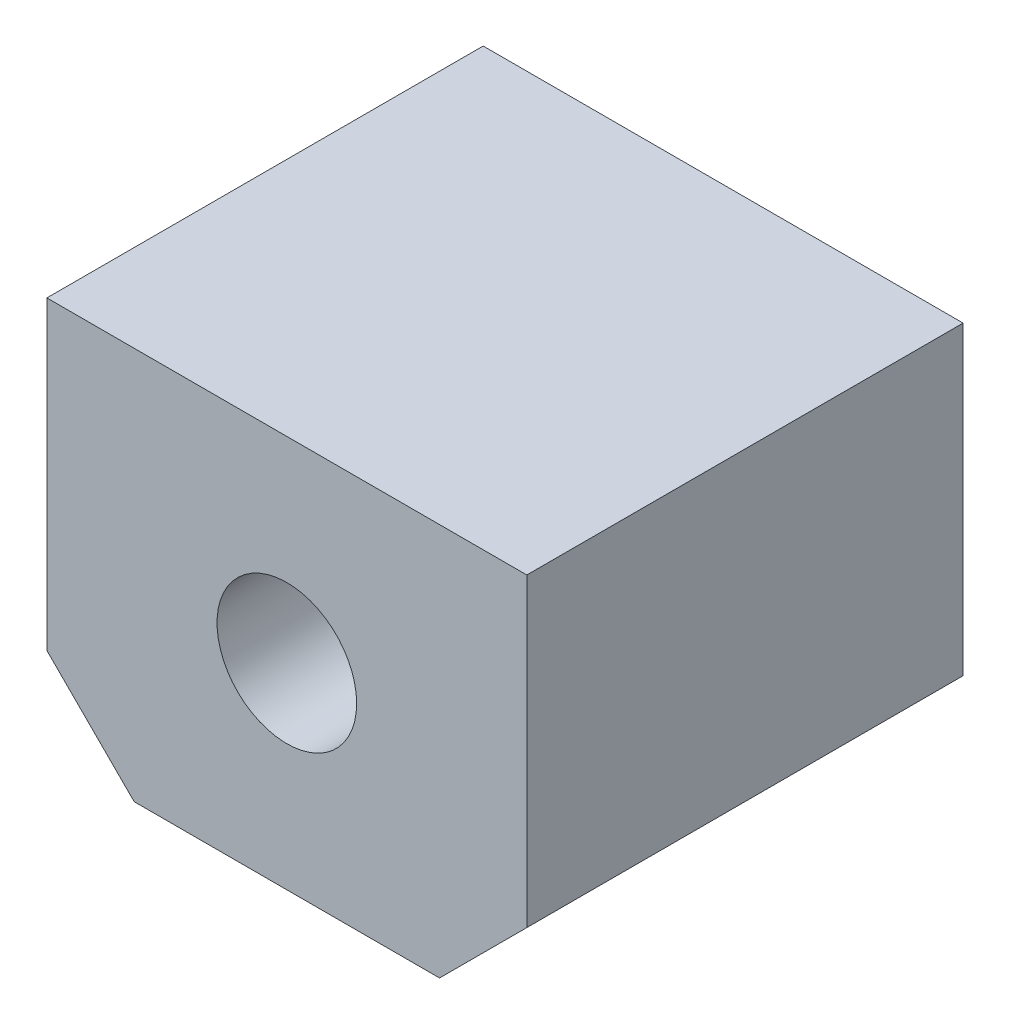
ISO-10303-21;
HEADER;
FILE_DESCRIPTION(('STEP AP214'),'2;1');
FILE_NAME('part.step','',(''),(''),'','','');
FILE_SCHEMA(('AUTOMOTIVE_DESIGN { 1 0 10303 214 1 1 1 1 }'));
ENDSEC;
DATA;
#1=APPLICATION_CONTEXT('core data for automotive mechanical design processes');
#2=APPLICATION_PROTOCOL_DEFINITION('international standard','automotive_design',2000,#1);
#3=PRODUCT_CONTEXT('',#1,'mechanical');
#4=PRODUCT('Part','Part','',(#3));
#5=PRODUCT_RELATED_PRODUCT_CATEGORY('part','',(#4));
#6=PRODUCT_DEFINITION_FORMATION('','',#4);
#7=PRODUCT_DEFINITION_CONTEXT('part definition',#1,'design');
#8=PRODUCT_DEFINITION('design','',#6,#7);
#9=PRODUCT_DEFINITION_SHAPE('','',#8);
#10=(LENGTH_UNIT() NAMED_UNIT(*) SI_UNIT(.MILLI.,.METRE.));
#11=(NAMED_UNIT(*) PLANE_ANGLE_UNIT() SI_UNIT($,.RADIAN.));
#12=(NAMED_UNIT(*) SI_UNIT($,.STERADIAN.) SOLID_ANGLE_UNIT());
#13=UNCERTAINTY_MEASURE_WITH_UNIT(LENGTH_MEASURE(1.E-05),#10,'distance_accuracy_value','');
#14=(GEOMETRIC_REPRESENTATION_CONTEXT(3) GLOBAL_UNCERTAINTY_ASSIGNED_CONTEXT((#13)) GLOBAL_UNIT_ASSIGNED_CONTEXT((#10,
#11,#12)) REPRESENTATION_CONTEXT('',''));
#15=CARTESIAN_POINT('',(0.,0.,0.));
#16=DIRECTION('',(0.,0.,1.));
#17=DIRECTION('',(1.,0.,0.));
#18=AXIS2_PLACEMENT_3D('',#15,#16,#17);
#19=CARTESIAN_POINT('',(0.,0.,50.));
#20=DIRECTION('',(0.,0.,1.));
#21=DIRECTION('',(1.,0.,0.));
#22=AXIS2_PLACEMENT_3D('',#19,#20,#21);
#23=PLANE('',#22);
#24=DIRECTION('',(0.,-1.,0.));
#25=VECTOR('',#24,1.);
#26=CARTESIAN_POINT('',(-27.5,-12.5,50.));
#27=LINE('',#26,#25);
#28=CARTESIAN_POINT('',(-27.5,22.5,50.));
#29=VERTEX_POINT('',#28);
#30=CARTESIAN_POINT('',(-27.5,-12.5,50.));
#31=VERTEX_POINT('',#30);
#32=EDGE_CURVE('E129',#29,#31,#27,.T.);
#33=ORIENTED_EDGE('',*,*,#32,.T.);
#34=DIRECTION('',(0.707106781186548,-0.707106781186547,0.));
#35=VECTOR('',#34,1.);
#36=CARTESIAN_POINT('',(-17.5,-22.5,50.));
#37=LINE('',#36,#35);
#38=CARTESIAN_POINT('',(-17.5,-22.5,50.));
#39=VERTEX_POINT('',#38);
#40=EDGE_CURVE('E87',#31,#39,#37,.T.);
#41=ORIENTED_EDGE('',*,*,#40,.T.);
#42=DIRECTION('',(1.,0.,0.));
#43=VECTOR('',#42,1.);
#44=CARTESIAN_POINT('',(17.5,-22.5,50.));
#45=LINE('',#44,#43);
#46=CARTESIAN_POINT('',(17.5,-22.5,50.));
#47=VERTEX_POINT('',#46);
#48=EDGE_CURVE('E100',#39,#47,#45,.T.);
#49=ORIENTED_EDGE('',*,*,#48,.T.);
#50=DIRECTION('',(0.707106781186548,0.707106781186548,0.));
#51=VECTOR('',#50,1.);
#52=CARTESIAN_POINT('',(27.5,-12.5,50.));
#53=LINE('',#52,#51);
#54=CARTESIAN_POINT('',(27.5,-12.5,50.));
#55=VERTEX_POINT('',#54);
#56=EDGE_CURVE('E94',#47,#55,#53,.T.);
#57=ORIENTED_EDGE('',*,*,#56,.T.);
#58=DIRECTION('',(0.,1.,0.));
#59=VECTOR('',#58,1.);
#60=CARTESIAN_POINT('',(27.5,-12.5,50.));
#61=LINE('',#60,#59);
#62=CARTESIAN_POINT('',(27.5,22.5,50.));
#63=VERTEX_POINT('',#62);
#64=EDGE_CURVE('E98',#55,#63,#61,.T.);
#65=ORIENTED_EDGE('',*,*,#64,.T.);
#66=DIRECTION('',(-1.,0.,0.));
#67=VECTOR('',#66,1.);
#68=CARTESIAN_POINT('',(27.5,22.5,50.));
#69=LINE('',#68,#67);
#70=EDGE_CURVE('E50',#63,#29,#69,.T.);
#71=ORIENTED_EDGE('',*,*,#70,.T.);
#72=EDGE_LOOP('',(#33,#41,#49,#57,#65,#71));
#73=FACE_BOUND('',#72,.T.);
#74=CARTESIAN_POINT('',(0.,0.,50.));
#75=DIRECTION('',(0.,0.,1.));
#76=DIRECTION('',(1.,0.,0.));
#77=AXIS2_PLACEMENT_3D('',#74,#75,#76);
#78=CIRCLE('',#77,8.);
#79=CARTESIAN_POINT('',(7.99999999999999,0.,50.));
#80=VERTEX_POINT('',#79);
#81=EDGE_CURVE('E122',#80,#80,#78,.T.);
#82=ORIENTED_EDGE('',*,*,#81,.F.);
#83=EDGE_LOOP('',(#82));
#84=FACE_BOUND('',#83,.T.);
#85=ADVANCED_FACE('F33',(#73,#84),#23,.T.);
#86=CARTESIAN_POINT('',(0.,0.,0.));
#87=DIRECTION('',(0.,0.,1.));
#88=DIRECTION('',(1.,0.,0.));
#89=AXIS2_PLACEMENT_3D('',#86,#87,#88);
#90=PLANE('',#89);
#91=DIRECTION('',(0.,-1.,0.));
#92=VECTOR('',#91,1.);
#93=CARTESIAN_POINT('',(-27.5,-12.5,0.));
#94=LINE('',#93,#92);
#95=CARTESIAN_POINT('',(-27.5,22.5,0.));
#96=VERTEX_POINT('',#95);
#97=CARTESIAN_POINT('',(-27.5,-12.5,0.));
#98=VERTEX_POINT('',#97);
#99=EDGE_CURVE('E118',#96,#98,#94,.T.);
#100=ORIENTED_EDGE('',*,*,#99,.F.);
#101=DIRECTION('',(-1.,0.,0.));
#102=VECTOR('',#101,1.);
#103=CARTESIAN_POINT('',(27.5,22.5,0.));
#104=LINE('',#103,#102);
#105=CARTESIAN_POINT('',(27.5,22.5,0.));
#106=VERTEX_POINT('',#105);
#107=EDGE_CURVE('E79',#106,#96,#104,.T.);
#108=ORIENTED_EDGE('',*,*,#107,.F.);
#109=DIRECTION('',(0.,1.,0.));
#110=VECTOR('',#109,1.);
#111=CARTESIAN_POINT('',(27.5,-12.5,0.));
#112=LINE('',#111,#110);
#113=CARTESIAN_POINT('',(27.5,-12.5,0.));
#114=VERTEX_POINT('',#113);
#115=EDGE_CURVE('E73',#114,#106,#112,.T.);
#116=ORIENTED_EDGE('',*,*,#115,.F.);
#117=DIRECTION('',(0.707106781186548,0.707106781186548,0.));
#118=VECTOR('',#117,1.);
#119=CARTESIAN_POINT('',(27.5,-12.5,0.));
#120=LINE('',#119,#118);
#121=CARTESIAN_POINT('',(17.5,-22.5,0.));
#122=VERTEX_POINT('',#121);
#123=EDGE_CURVE('E108',#122,#114,#120,.T.);
#124=ORIENTED_EDGE('',*,*,#123,.F.);
#125=DIRECTION('',(1.,0.,0.));
#126=VECTOR('',#125,1.);
#127=CARTESIAN_POINT('',(17.5,-22.5,0.));
#128=LINE('',#127,#126);
#129=CARTESIAN_POINT('',(-17.5,-22.5,0.));
#130=VERTEX_POINT('',#129);
#131=EDGE_CURVE('E124',#130,#122,#128,.T.);
#132=ORIENTED_EDGE('',*,*,#131,.F.);
#133=DIRECTION('',(0.707106781186548,-0.707106781186547,0.));
#134=VECTOR('',#133,1.);
#135=CARTESIAN_POINT('',(-17.5,-22.5,0.));
#136=LINE('',#135,#134);
#137=EDGE_CURVE('E121',#98,#130,#136,.T.);
#138=ORIENTED_EDGE('',*,*,#137,.F.);
#139=EDGE_LOOP('',(#100,#108,#116,#124,#132,#138));
#140=FACE_BOUND('',#139,.T.);
#141=CARTESIAN_POINT('',(0.,0.,0.));
#142=DIRECTION('',(0.,0.,1.));
#143=DIRECTION('',(1.,0.,0.));
#144=AXIS2_PLACEMENT_3D('',#141,#142,#143);
#145=CIRCLE('',#144,8.);
#146=CARTESIAN_POINT('',(7.99999999999999,0.,0.));
#147=VERTEX_POINT('',#146);
#148=EDGE_CURVE('E222',#147,#147,#145,.T.);
#149=ORIENTED_EDGE('',*,*,#148,.T.);
#150=EDGE_LOOP('',(#149));
#151=FACE_BOUND('',#150,.T.);
#152=ADVANCED_FACE('F138',(#140,#151),#90,.F.);
#153=CARTESIAN_POINT('',(-27.5,-12.5,50.));
#154=DIRECTION('',(1.,0.,0.));
#155=DIRECTION('',(0.,0.,-1.));
#156=AXIS2_PLACEMENT_3D('',#153,#154,#155);
#157=PLANE('',#156);
#158=ORIENTED_EDGE('',*,*,#99,.T.);
#159=DIRECTION('',(0.,0.,-1.));
#160=VECTOR('',#159,1.);
#161=CARTESIAN_POINT('',(-27.5,-12.5,50.));
#162=LINE('',#161,#160);
#163=EDGE_CURVE('E11',#31,#98,#162,.T.);
#164=ORIENTED_EDGE('',*,*,#163,.F.);
#165=ORIENTED_EDGE('',*,*,#32,.F.);
#166=DIRECTION('',(0.,0.,-1.));
#167=VECTOR('',#166,1.);
#168=CARTESIAN_POINT('',(-27.5,22.5,50.));
#169=LINE('',#168,#167);
#170=EDGE_CURVE('E114',#29,#96,#169,.T.);
#171=ORIENTED_EDGE('',*,*,#170,.T.);
#172=EDGE_LOOP('',(#158,#164,#165,#171));
#173=FACE_BOUND('',#172,.T.);
#174=ADVANCED_FACE('F35',(#173),#157,.F.);
#175=CARTESIAN_POINT('',(-17.5,-22.5,50.));
#176=DIRECTION('',(0.707106781186547,0.707106781186548,0.));
#177=DIRECTION('',(-0.707106781186548,0.707106781186547,0.));
#178=AXIS2_PLACEMENT_3D('',#175,#176,#177);
#179=PLANE('',#178);
#180=ORIENTED_EDGE('',*,*,#137,.T.);
#181=DIRECTION('',(0.,0.,-1.));
#182=VECTOR('',#181,1.);
#183=CARTESIAN_POINT('',(-17.5,-22.5,50.));
#184=LINE('',#183,#182);
#185=EDGE_CURVE('E42',#39,#130,#184,.T.);
#186=ORIENTED_EDGE('',*,*,#185,.F.);
#187=ORIENTED_EDGE('',*,*,#40,.F.);
#188=ORIENTED_EDGE('',*,*,#163,.T.);
#189=EDGE_LOOP('',(#180,#186,#187,#188));
#190=FACE_BOUND('',#189,.T.);
#191=ADVANCED_FACE('F163',(#190),#179,.F.);
#192=CARTESIAN_POINT('',(17.5,-22.5,50.));
#193=DIRECTION('',(0.,1.,0.));
#194=DIRECTION('',(-1.,0.,0.));
#195=AXIS2_PLACEMENT_3D('',#192,#193,#194);
#196=PLANE('',#195);
#197=ORIENTED_EDGE('',*,*,#131,.T.);
#198=DIRECTION('',(0.,0.,-1.));
#199=VECTOR('',#198,1.);
#200=CARTESIAN_POINT('',(17.5,-22.5,50.));
#201=LINE('',#200,#199);
#202=EDGE_CURVE('E109',#47,#122,#201,.T.);
#203=ORIENTED_EDGE('',*,*,#202,.F.);
#204=ORIENTED_EDGE('',*,*,#48,.F.);
#205=ORIENTED_EDGE('',*,*,#185,.T.);
#206=EDGE_LOOP('',(#197,#203,#204,#205));
#207=FACE_BOUND('',#206,.T.);
#208=ADVANCED_FACE('F135',(#207),#196,.F.);
#209=CARTESIAN_POINT('',(27.5,-12.5,50.));
#210=DIRECTION('',(-0.707106781186548,0.707106781186548,0.));
#211=DIRECTION('',(-0.707106781186548,-0.707106781186548,0.));
#212=AXIS2_PLACEMENT_3D('',#209,#210,#211);
#213=PLANE('',#212);
#214=ORIENTED_EDGE('',*,*,#123,.T.);
#215=DIRECTION('',(0.,0.,-1.));
#216=VECTOR('',#215,1.);
#217=CARTESIAN_POINT('',(27.5,-12.5,50.));
#218=LINE('',#217,#216);
#219=EDGE_CURVE('E105',#55,#114,#218,.T.);
#220=ORIENTED_EDGE('',*,*,#219,.F.);
#221=ORIENTED_EDGE('',*,*,#56,.F.);
#222=ORIENTED_EDGE('',*,*,#202,.T.);
#223=EDGE_LOOP('',(#214,#220,#221,#222));
#224=FACE_BOUND('',#223,.T.);
#225=ADVANCED_FACE('F106',(#224),#213,.F.);
#226=CARTESIAN_POINT('',(27.5,-12.5,50.));
#227=DIRECTION('',(-1.,0.,0.));
#228=DIRECTION('',(0.,0.,1.));
#229=AXIS2_PLACEMENT_3D('',#226,#227,#228);
#230=PLANE('',#229);
#231=ORIENTED_EDGE('',*,*,#115,.T.);
#232=DIRECTION('',(0.,0.,-1.));
#233=VECTOR('',#232,1.);
#234=CARTESIAN_POINT('',(27.5,22.5,50.));
#235=LINE('',#234,#233);
#236=EDGE_CURVE('E110',#63,#106,#235,.T.);
#237=ORIENTED_EDGE('',*,*,#236,.F.);
#238=ORIENTED_EDGE('',*,*,#64,.F.);
#239=ORIENTED_EDGE('',*,*,#219,.T.);
#240=EDGE_LOOP('',(#231,#237,#238,#239));
#241=FACE_BOUND('',#240,.T.);
#242=ADVANCED_FACE('F112',(#241),#230,.F.);
#243=CARTESIAN_POINT('',(27.5,22.5,50.));
#244=DIRECTION('',(0.,-1.,0.));
#245=DIRECTION('',(1.,0.,0.));
#246=AXIS2_PLACEMENT_3D('',#243,#244,#245);
#247=PLANE('',#246);
#248=ORIENTED_EDGE('',*,*,#107,.T.);
#249=ORIENTED_EDGE('',*,*,#170,.F.);
#250=ORIENTED_EDGE('',*,*,#70,.F.);
#251=ORIENTED_EDGE('',*,*,#236,.T.);
#252=EDGE_LOOP('',(#248,#249,#250,#251));
#253=FACE_BOUND('',#252,.T.);
#254=ADVANCED_FACE('F143',(#253),#247,.F.);
#255=CARTESIAN_POINT('',(0.,0.,50.));
#256=DIRECTION('',(0.,0.,-1.));
#257=DIRECTION('',(-1.,0.,0.));
#258=AXIS2_PLACEMENT_3D('',#255,#256,#257);
#259=CYLINDRICAL_SURFACE('',#258,8.);
#260=ORIENTED_EDGE('',*,*,#81,.T.);
#261=EDGE_LOOP('',(#260));
#262=FACE_BOUND('',#261,.T.);
#263=ORIENTED_EDGE('',*,*,#148,.F.);
#264=EDGE_LOOP('',(#263));
#265=FACE_BOUND('',#264,.T.);
#266=ADVANCED_FACE('F145',(#262,#265),#259,.F.);
#267=CLOSED_SHELL('',(#85,#152,#174,#191,#208,#225,#242,#254,#266));
#268=MANIFOLD_SOLID_BREP('B2',#267);
#269=ADVANCED_BREP_SHAPE_REPRESENTATION('',(#18,#268),#14);
#270=SHAPE_DEFINITION_REPRESENTATION(#9,#269);
ENDSEC;
END-ISO-10303-21;
